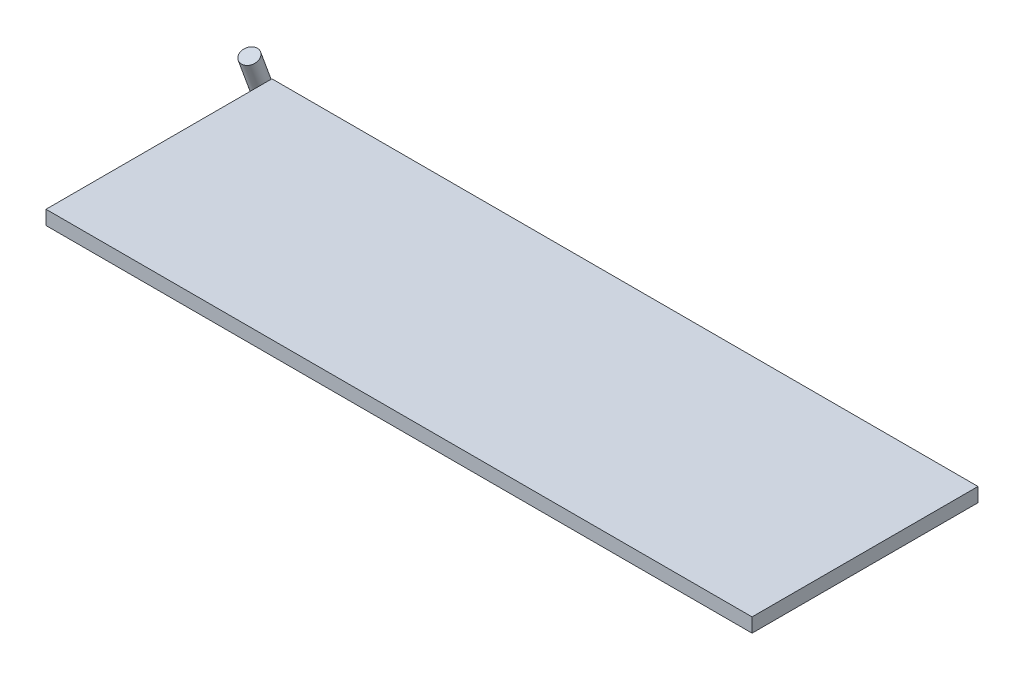
ISO-10303-21;
HEADER;
FILE_DESCRIPTION(('STEP AP214'),'2;1');
FILE_NAME('part.step','',(''),(''),'','','');
FILE_SCHEMA(('AUTOMOTIVE_DESIGN { 1 0 10303 214 1 1 1 1 }'));
ENDSEC;
DATA;
#1=APPLICATION_CONTEXT('core data for automotive mechanical design processes');
#2=APPLICATION_PROTOCOL_DEFINITION('international standard','automotive_design',2000,#1);
#3=PRODUCT_CONTEXT('',#1,'mechanical');
#4=PRODUCT('Part','Part','',(#3));
#5=PRODUCT_RELATED_PRODUCT_CATEGORY('part','',(#4));
#6=PRODUCT_DEFINITION_FORMATION('','',#4);
#7=PRODUCT_DEFINITION_CONTEXT('part definition',#1,'design');
#8=PRODUCT_DEFINITION('design','',#6,#7);
#9=PRODUCT_DEFINITION_SHAPE('','',#8);
#10=(LENGTH_UNIT() NAMED_UNIT(*) SI_UNIT(.MILLI.,.METRE.));
#11=(NAMED_UNIT(*) PLANE_ANGLE_UNIT() SI_UNIT($,.RADIAN.));
#12=(NAMED_UNIT(*) SI_UNIT($,.STERADIAN.) SOLID_ANGLE_UNIT());
#13=UNCERTAINTY_MEASURE_WITH_UNIT(LENGTH_MEASURE(1.E-05),#10,'distance_accuracy_value','');
#14=(GEOMETRIC_REPRESENTATION_CONTEXT(3) GLOBAL_UNCERTAINTY_ASSIGNED_CONTEXT((#13)) GLOBAL_UNIT_ASSIGNED_CONTEXT((#10,
#11,#12)) REPRESENTATION_CONTEXT('',''));
#15=CARTESIAN_POINT('',(0.,0.,0.));
#16=DIRECTION('',(0.,0.,1.));
#17=DIRECTION('',(1.,0.,0.));
#18=AXIS2_PLACEMENT_3D('',#15,#16,#17);
#19=CARTESIAN_POINT('',(-228.679664398072,12.267934416538,-69.3554227112996));
#20=DIRECTION('',(0.,-0.939692620785908,-0.342020143325669));
#21=DIRECTION('',(0.,0.342020143325669,-0.939692620785908));
#22=AXIS2_PLACEMENT_3D('',#19,#20,#21);
#23=CYLINDRICAL_SURFACE('',#22,3.);
#24=CARTESIAN_POINT('',(-228.679664398072,12.267934416538,-69.3554227112996));
#25=DIRECTION('',(0.,-0.939692620785908,-0.342020143325669));
#26=DIRECTION('',(0.,0.342020143325669,-0.939692620785908));
#27=AXIS2_PLACEMENT_3D('',#24,#25,#26);
#28=CIRCLE('',#27,3.);
#29=CARTESIAN_POINT('',(-228.679664398072,13.293994846515,-72.1745005736573));
#30=VERTEX_POINT('',#29);
#31=EDGE_CURVE('E11',#30,#30,#28,.T.);
#32=ORIENTED_EDGE('',*,*,#31,.T.);
#33=EDGE_LOOP('',(#32));
#34=FACE_BOUND('',#33,.T.);
#35=CARTESIAN_POINT('',(-228.679664398072,0.0519303463212134,-73.8016845745333));
#36=DIRECTION('',(0.,-0.939692620785908,-0.342020143325669));
#37=DIRECTION('',(0.,0.342020143325669,-0.939692620785908));
#38=AXIS2_PLACEMENT_3D('',#35,#36,#37);
#39=CIRCLE('',#38,3.);
#40=CARTESIAN_POINT('',(-228.679664398072,1.07799077629822,-76.620762436891));
#41=VERTEX_POINT('',#40);
#42=EDGE_CURVE('E46',#41,#41,#39,.T.);
#43=ORIENTED_EDGE('',*,*,#42,.F.);
#44=EDGE_LOOP('',(#43));
#45=FACE_BOUND('',#44,.T.);
#46=ADVANCED_FACE('F43',(#34,#45),#23,.T.);
#47=CARTESIAN_POINT('',(-228.679664398072,12.267934416538,-69.3554227112996));
#48=DIRECTION('',(0.,-0.939692620785908,-0.342020143325669));
#49=DIRECTION('',(0.,0.342020143325669,-0.939692620785908));
#50=AXIS2_PLACEMENT_3D('',#47,#48,#49);
#51=PLANE('',#50);
#52=ORIENTED_EDGE('',*,*,#31,.F.);
#53=EDGE_LOOP('',(#52));
#54=FACE_BOUND('',#53,.T.);
#55=ADVANCED_FACE('F58',(#54),#51,.F.);
#56=CARTESIAN_POINT('',(-228.679664398072,0.0519303463212134,-73.8016845745333));
#57=DIRECTION('',(0.,-0.939692620785908,-0.342020143325669));
#58=DIRECTION('',(0.,0.342020143325669,-0.939692620785908));
#59=AXIS2_PLACEMENT_3D('',#56,#57,#58);
#60=PLANE('',#59);
#61=ORIENTED_EDGE('',*,*,#42,.T.);
#62=EDGE_LOOP('',(#61));
#63=FACE_BOUND('',#62,.T.);
#64=ADVANCED_FACE('F55',(#63),#60,.T.);
#65=CLOSED_SHELL('',(#46,#55,#64));
#66=MANIFOLD_SOLID_BREP('B2',#65);
#67=CARTESIAN_POINT('',(-225.,5.,-73.6590071206314));
#68=DIRECTION('',(1.,0.,0.));
#69=DIRECTION('',(0.,0.,-1.));
#70=AXIS2_PLACEMENT_3D('',#67,#68,#69);
#71=PLANE('',#70);
#72=DIRECTION('',(0.,0.,1.));
#73=VECTOR('',#72,1.);
#74=CARTESIAN_POINT('',(-225.,0.,-73.6590071206314));
#75=LINE('',#74,#73);
#76=CARTESIAN_POINT('',(-225.,0.,-73.6590071206314));
#77=VERTEX_POINT('',#76);
#78=CARTESIAN_POINT('',(-225.,0.,6.34099287936864));
#79=VERTEX_POINT('',#78);
#80=EDGE_CURVE('E146',#77,#79,#75,.T.);
#81=ORIENTED_EDGE('',*,*,#80,.T.);
#82=DIRECTION('',(0.,-1.,0.));
#83=VECTOR('',#82,1.);
#84=CARTESIAN_POINT('',(-225.,5.,6.34099287936864));
#85=LINE('',#84,#83);
#86=CARTESIAN_POINT('',(-225.,5.,6.34099287936864));
#87=VERTEX_POINT('',#86);
#88=EDGE_CURVE('E41',#87,#79,#85,.T.);
#89=ORIENTED_EDGE('',*,*,#88,.F.);
#90=DIRECTION('',(0.,0.,1.));
#91=VECTOR('',#90,1.);
#92=CARTESIAN_POINT('',(-225.,5.,-73.6590071206314));
#93=LINE('',#92,#91);
#94=CARTESIAN_POINT('',(-225.,5.,-73.6590071206314));
#95=VERTEX_POINT('',#94);
#96=EDGE_CURVE('E134',#95,#87,#93,.T.);
#97=ORIENTED_EDGE('',*,*,#96,.F.);
#98=DIRECTION('',(0.,-1.,0.));
#99=VECTOR('',#98,1.);
#100=CARTESIAN_POINT('',(-225.,5.,-73.6590071206314));
#101=LINE('',#100,#99);
#102=EDGE_CURVE('E142',#95,#77,#101,.T.);
#103=ORIENTED_EDGE('',*,*,#102,.T.);
#104=EDGE_LOOP('',(#81,#89,#97,#103));
#105=FACE_BOUND('',#104,.T.);
#106=ADVANCED_FACE('F83',(#105),#71,.F.);
#107=CARTESIAN_POINT('',(-225.,5.,6.34099287936864));
#108=DIRECTION('',(0.,0.,-1.));
#109=DIRECTION('',(-1.,0.,0.));
#110=AXIS2_PLACEMENT_3D('',#107,#108,#109);
#111=PLANE('',#110);
#112=DIRECTION('',(1.,0.,0.));
#113=VECTOR('',#112,1.);
#114=CARTESIAN_POINT('',(-225.,0.,6.34099287936864));
#115=LINE('',#114,#113);
#116=CARTESIAN_POINT('',(25.,0.,6.34099287936864));
#117=VERTEX_POINT('',#116);
#118=EDGE_CURVE('E138',#79,#117,#115,.T.);
#119=ORIENTED_EDGE('',*,*,#118,.T.);
#120=DIRECTION('',(0.,-1.,0.));
#121=VECTOR('',#120,1.);
#122=CARTESIAN_POINT('',(25.,5.,6.34099287936864));
#123=LINE('',#122,#121);
#124=CARTESIAN_POINT('',(25.,5.,6.34099287936864));
#125=VERTEX_POINT('',#124);
#126=EDGE_CURVE('E91',#125,#117,#123,.T.);
#127=ORIENTED_EDGE('',*,*,#126,.F.);
#128=DIRECTION('',(1.,0.,0.));
#129=VECTOR('',#128,1.);
#130=CARTESIAN_POINT('',(-225.,5.,6.34099287936864));
#131=LINE('',#130,#129);
#132=EDGE_CURVE('E129',#87,#125,#131,.T.);
#133=ORIENTED_EDGE('',*,*,#132,.F.);
#134=ORIENTED_EDGE('',*,*,#88,.T.);
#135=EDGE_LOOP('',(#119,#127,#133,#134));
#136=FACE_BOUND('',#135,.T.);
#137=ADVANCED_FACE('F137',(#136),#111,.F.);
#138=CARTESIAN_POINT('',(25.,5.,-73.6590071206314));
#139=DIRECTION('',(-1.,0.,0.));
#140=DIRECTION('',(0.,0.,1.));
#141=AXIS2_PLACEMENT_3D('',#138,#139,#140);
#142=PLANE('',#141);
#143=DIRECTION('',(0.,0.,-1.));
#144=VECTOR('',#143,1.);
#145=CARTESIAN_POINT('',(25.,0.,-73.6590071206314));
#146=LINE('',#145,#144);
#147=CARTESIAN_POINT('',(25.,0.,-73.6590071206314));
#148=VERTEX_POINT('',#147);
#149=EDGE_CURVE('E116',#117,#148,#146,.T.);
#150=ORIENTED_EDGE('',*,*,#149,.T.);
#151=DIRECTION('',(0.,-1.,0.));
#152=VECTOR('',#151,1.);
#153=CARTESIAN_POINT('',(25.,5.,-73.6590071206314));
#154=LINE('',#153,#152);
#155=CARTESIAN_POINT('',(25.,5.,-73.6590071206314));
#156=VERTEX_POINT('',#155);
#157=EDGE_CURVE('E139',#156,#148,#154,.T.);
#158=ORIENTED_EDGE('',*,*,#157,.F.);
#159=DIRECTION('',(0.,0.,-1.));
#160=VECTOR('',#159,1.);
#161=CARTESIAN_POINT('',(25.,5.,-73.6590071206314));
#162=LINE('',#161,#160);
#163=EDGE_CURVE('E132',#125,#156,#162,.T.);
#164=ORIENTED_EDGE('',*,*,#163,.F.);
#165=ORIENTED_EDGE('',*,*,#126,.T.);
#166=EDGE_LOOP('',(#150,#158,#164,#165));
#167=FACE_BOUND('',#166,.T.);
#168=ADVANCED_FACE('F140',(#167),#142,.F.);
#169=CARTESIAN_POINT('',(-225.,5.,-73.6590071206314));
#170=DIRECTION('',(0.,0.,1.));
#171=DIRECTION('',(1.,0.,0.));
#172=AXIS2_PLACEMENT_3D('',#169,#170,#171);
#173=PLANE('',#172);
#174=DIRECTION('',(-1.,0.,0.));
#175=VECTOR('',#174,1.);
#176=CARTESIAN_POINT('',(-225.,0.,-73.6590071206314));
#177=LINE('',#176,#175);
#178=EDGE_CURVE('E122',#148,#77,#177,.T.);
#179=ORIENTED_EDGE('',*,*,#178,.T.);
#180=ORIENTED_EDGE('',*,*,#102,.F.);
#181=DIRECTION('',(-1.,0.,0.));
#182=VECTOR('',#181,1.);
#183=CARTESIAN_POINT('',(-225.,5.,-73.6590071206314));
#184=LINE('',#183,#182);
#185=EDGE_CURVE('E99',#156,#95,#184,.T.);
#186=ORIENTED_EDGE('',*,*,#185,.F.);
#187=ORIENTED_EDGE('',*,*,#157,.T.);
#188=EDGE_LOOP('',(#179,#180,#186,#187));
#189=FACE_BOUND('',#188,.T.);
#190=ADVANCED_FACE('F153',(#189),#173,.F.);
#191=CARTESIAN_POINT('',(0.,5.,0.));
#192=DIRECTION('',(0.,1.,0.));
#193=DIRECTION('',(0.,0.,1.));
#194=AXIS2_PLACEMENT_3D('',#191,#192,#193);
#195=PLANE('',#194);
#196=ORIENTED_EDGE('',*,*,#96,.T.);
#197=ORIENTED_EDGE('',*,*,#132,.T.);
#198=ORIENTED_EDGE('',*,*,#163,.T.);
#199=ORIENTED_EDGE('',*,*,#185,.T.);
#200=EDGE_LOOP('',(#196,#197,#198,#199));
#201=FACE_BOUND('',#200,.T.);
#202=ADVANCED_FACE('F130',(#201),#195,.T.);
#203=CARTESIAN_POINT('',(0.,0.,0.));
#204=DIRECTION('',(0.,1.,0.));
#205=DIRECTION('',(0.,0.,1.));
#206=AXIS2_PLACEMENT_3D('',#203,#204,#205);
#207=PLANE('',#206);
#208=ORIENTED_EDGE('',*,*,#80,.F.);
#209=ORIENTED_EDGE('',*,*,#178,.F.);
#210=ORIENTED_EDGE('',*,*,#149,.F.);
#211=ORIENTED_EDGE('',*,*,#118,.F.);
#212=EDGE_LOOP('',(#208,#209,#210,#211));
#213=FACE_BOUND('',#212,.T.);
#214=ADVANCED_FACE('F156',(#213),#207,.F.);
#215=CLOSED_SHELL('',(#106,#137,#168,#190,#202,#214));
#216=MANIFOLD_SOLID_BREP('B6',#215);
#217=ADVANCED_BREP_SHAPE_REPRESENTATION('',(#18,#66,#216),#14);
#218=SHAPE_DEFINITION_REPRESENTATION(#9,#217);
ENDSEC;
END-ISO-10303-21;
